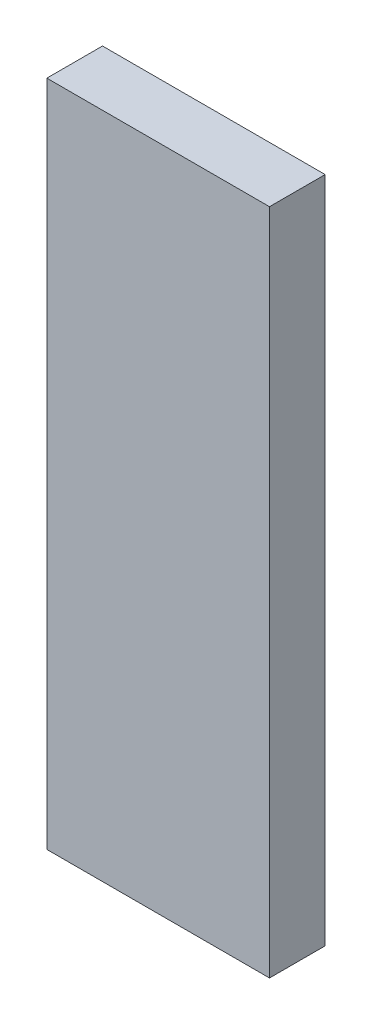
ISO-10303-21;
HEADER;
FILE_DESCRIPTION(('STEP AP214'),'2;1');
FILE_NAME('part.step','',(''),(''),'','','');
FILE_SCHEMA(('AUTOMOTIVE_DESIGN { 1 0 10303 214 1 1 1 1 }'));
ENDSEC;
DATA;
#1=APPLICATION_CONTEXT('core data for automotive mechanical design processes');
#2=APPLICATION_PROTOCOL_DEFINITION('international standard','automotive_design',2000,#1);
#3=PRODUCT_CONTEXT('',#1,'mechanical');
#4=PRODUCT('Part','Part','',(#3));
#5=PRODUCT_RELATED_PRODUCT_CATEGORY('part','',(#4));
#6=PRODUCT_DEFINITION_FORMATION('','',#4);
#7=PRODUCT_DEFINITION_CONTEXT('part definition',#1,'design');
#8=PRODUCT_DEFINITION('design','',#6,#7);
#9=PRODUCT_DEFINITION_SHAPE('','',#8);
#10=(LENGTH_UNIT() NAMED_UNIT(*) SI_UNIT(.MILLI.,.METRE.));
#11=(NAMED_UNIT(*) PLANE_ANGLE_UNIT() SI_UNIT($,.RADIAN.));
#12=(NAMED_UNIT(*) SI_UNIT($,.STERADIAN.) SOLID_ANGLE_UNIT());
#13=UNCERTAINTY_MEASURE_WITH_UNIT(LENGTH_MEASURE(1.E-05),#10,'distance_accuracy_value','');
#14=(GEOMETRIC_REPRESENTATION_CONTEXT(3) GLOBAL_UNCERTAINTY_ASSIGNED_CONTEXT((#13)) GLOBAL_UNIT_ASSIGNED_CONTEXT((#10,
#11,#12)) REPRESENTATION_CONTEXT('',''));
#15=CARTESIAN_POINT('',(0.,0.,0.));
#16=DIRECTION('',(0.,0.,1.));
#17=DIRECTION('',(1.,0.,0.));
#18=AXIS2_PLACEMENT_3D('',#15,#16,#17);
#19=CARTESIAN_POINT('',(0.,152.4,0.));
#20=DIRECTION('',(1.,0.,0.));
#21=DIRECTION('',(0.,0.,-1.));
#22=AXIS2_PLACEMENT_3D('',#19,#20,#21);
#23=PLANE('',#22);
#24=DIRECTION('',(0.,0.,1.));
#25=VECTOR('',#24,1.);
#26=CARTESIAN_POINT('',(0.,0.,0.));
#27=LINE('',#26,#25);
#28=CARTESIAN_POINT('',(0.,0.,-12.7));
#29=VERTEX_POINT('',#28);
#30=CARTESIAN_POINT('',(0.,0.,0.));
#31=VERTEX_POINT('',#30);
#32=EDGE_CURVE('E107',#29,#31,#27,.T.);
#33=ORIENTED_EDGE('',*,*,#32,.T.);
#34=DIRECTION('',(0.,-1.,0.));
#35=VECTOR('',#34,1.);
#36=CARTESIAN_POINT('',(0.,152.4,0.));
#37=LINE('',#36,#35);
#38=CARTESIAN_POINT('',(0.,152.4,0.));
#39=VERTEX_POINT('',#38);
#40=EDGE_CURVE('E11',#39,#31,#37,.T.);
#41=ORIENTED_EDGE('',*,*,#40,.F.);
#42=DIRECTION('',(0.,0.,1.));
#43=VECTOR('',#42,1.);
#44=CARTESIAN_POINT('',(0.,152.4,0.));
#45=LINE('',#44,#43);
#46=CARTESIAN_POINT('',(0.,152.4,-12.7));
#47=VERTEX_POINT('',#46);
#48=EDGE_CURVE('E91',#47,#39,#45,.T.);
#49=ORIENTED_EDGE('',*,*,#48,.F.);
#50=DIRECTION('',(0.,-1.,0.));
#51=VECTOR('',#50,1.);
#52=CARTESIAN_POINT('',(0.,152.4,-12.7));
#53=LINE('',#52,#51);
#54=EDGE_CURVE('E103',#47,#29,#53,.T.);
#55=ORIENTED_EDGE('',*,*,#54,.T.);
#56=EDGE_LOOP('',(#33,#41,#49,#55));
#57=FACE_BOUND('',#56,.T.);
#58=ADVANCED_FACE('F39',(#57),#23,.F.);
#59=CARTESIAN_POINT('',(0.,152.4,0.));
#60=DIRECTION('',(0.,0.,-1.));
#61=DIRECTION('',(-1.,0.,0.));
#62=AXIS2_PLACEMENT_3D('',#59,#60,#61);
#63=PLANE('',#62);
#64=DIRECTION('',(1.,0.,0.));
#65=VECTOR('',#64,1.);
#66=CARTESIAN_POINT('',(0.,0.,0.));
#67=LINE('',#66,#65);
#68=CARTESIAN_POINT('',(50.8,0.,0.));
#69=VERTEX_POINT('',#68);
#70=EDGE_CURVE('E96',#31,#69,#67,.T.);
#71=ORIENTED_EDGE('',*,*,#70,.T.);
#72=DIRECTION('',(0.,-1.,0.));
#73=VECTOR('',#72,1.);
#74=CARTESIAN_POINT('',(50.8,152.4,0.));
#75=LINE('',#74,#73);
#76=CARTESIAN_POINT('',(50.8,152.4,0.));
#77=VERTEX_POINT('',#76);
#78=EDGE_CURVE('E48',#77,#69,#75,.T.);
#79=ORIENTED_EDGE('',*,*,#78,.F.);
#80=DIRECTION('',(1.,0.,0.));
#81=VECTOR('',#80,1.);
#82=CARTESIAN_POINT('',(0.,152.4,0.));
#83=LINE('',#82,#81);
#84=EDGE_CURVE('E86',#39,#77,#83,.T.);
#85=ORIENTED_EDGE('',*,*,#84,.F.);
#86=ORIENTED_EDGE('',*,*,#40,.T.);
#87=EDGE_LOOP('',(#71,#79,#85,#86));
#88=FACE_BOUND('',#87,.T.);
#89=ADVANCED_FACE('F95',(#88),#63,.F.);
#90=CARTESIAN_POINT('',(50.8,152.4,0.));
#91=DIRECTION('',(-1.,0.,0.));
#92=DIRECTION('',(0.,0.,1.));
#93=AXIS2_PLACEMENT_3D('',#90,#91,#92);
#94=PLANE('',#93);
#95=DIRECTION('',(0.,0.,-1.));
#96=VECTOR('',#95,1.);
#97=CARTESIAN_POINT('',(50.8,0.,0.));
#98=LINE('',#97,#96);
#99=CARTESIAN_POINT('',(50.8,0.,-12.7));
#100=VERTEX_POINT('',#99);
#101=EDGE_CURVE('E73',#69,#100,#98,.T.);
#102=ORIENTED_EDGE('',*,*,#101,.T.);
#103=DIRECTION('',(0.,-1.,0.));
#104=VECTOR('',#103,1.);
#105=CARTESIAN_POINT('',(50.8,152.4,-12.7));
#106=LINE('',#105,#104);
#107=CARTESIAN_POINT('',(50.8,152.4,-12.7));
#108=VERTEX_POINT('',#107);
#109=EDGE_CURVE('E98',#108,#100,#106,.T.);
#110=ORIENTED_EDGE('',*,*,#109,.F.);
#111=DIRECTION('',(0.,0.,-1.));
#112=VECTOR('',#111,1.);
#113=CARTESIAN_POINT('',(50.8,152.4,0.));
#114=LINE('',#113,#112);
#115=EDGE_CURVE('E89',#77,#108,#114,.T.);
#116=ORIENTED_EDGE('',*,*,#115,.F.);
#117=ORIENTED_EDGE('',*,*,#78,.T.);
#118=EDGE_LOOP('',(#102,#110,#116,#117));
#119=FACE_BOUND('',#118,.T.);
#120=ADVANCED_FACE('F99',(#119),#94,.F.);
#121=CARTESIAN_POINT('',(0.,152.4,-12.7));
#122=DIRECTION('',(0.,0.,1.));
#123=DIRECTION('',(1.,0.,0.));
#124=AXIS2_PLACEMENT_3D('',#121,#122,#123);
#125=PLANE('',#124);
#126=DIRECTION('',(-1.,0.,0.));
#127=VECTOR('',#126,1.);
#128=CARTESIAN_POINT('',(0.,0.,-12.7));
#129=LINE('',#128,#127);
#130=EDGE_CURVE('E79',#100,#29,#129,.T.);
#131=ORIENTED_EDGE('',*,*,#130,.T.);
#132=ORIENTED_EDGE('',*,*,#54,.F.);
#133=DIRECTION('',(-1.,0.,0.));
#134=VECTOR('',#133,1.);
#135=CARTESIAN_POINT('',(0.,152.4,-12.7));
#136=LINE('',#135,#134);
#137=EDGE_CURVE('E56',#108,#47,#136,.T.);
#138=ORIENTED_EDGE('',*,*,#137,.F.);
#139=ORIENTED_EDGE('',*,*,#109,.T.);
#140=EDGE_LOOP('',(#131,#132,#138,#139));
#141=FACE_BOUND('',#140,.T.);
#142=ADVANCED_FACE('F120',(#141),#125,.F.);
#143=CARTESIAN_POINT('',(0.,152.4,0.));
#144=DIRECTION('',(0.,-1.,0.));
#145=DIRECTION('',(0.,0.,-1.));
#146=AXIS2_PLACEMENT_3D('',#143,#144,#145);
#147=PLANE('',#146);
#148=ORIENTED_EDGE('',*,*,#48,.T.);
#149=ORIENTED_EDGE('',*,*,#84,.T.);
#150=ORIENTED_EDGE('',*,*,#115,.T.);
#151=ORIENTED_EDGE('',*,*,#137,.T.);
#152=EDGE_LOOP('',(#148,#149,#150,#151));
#153=FACE_BOUND('',#152,.T.);
#154=ADVANCED_FACE('F87',(#153),#147,.F.);
#155=CARTESIAN_POINT('',(0.,0.,0.));
#156=DIRECTION('',(0.,-1.,0.));
#157=DIRECTION('',(0.,0.,-1.));
#158=AXIS2_PLACEMENT_3D('',#155,#156,#157);
#159=PLANE('',#158);
#160=ORIENTED_EDGE('',*,*,#32,.F.);
#161=ORIENTED_EDGE('',*,*,#130,.F.);
#162=ORIENTED_EDGE('',*,*,#101,.F.);
#163=ORIENTED_EDGE('',*,*,#70,.F.);
#164=EDGE_LOOP('',(#160,#161,#162,#163));
#165=FACE_BOUND('',#164,.T.);
#166=ADVANCED_FACE('F123',(#165),#159,.T.);
#167=CLOSED_SHELL('',(#58,#89,#120,#142,#154,#166));
#168=MANIFOLD_SOLID_BREP('B2',#167);
#169=ADVANCED_BREP_SHAPE_REPRESENTATION('',(#18,#168),#14);
#170=SHAPE_DEFINITION_REPRESENTATION(#9,#169);
ENDSEC;
END-ISO-10303-21;
